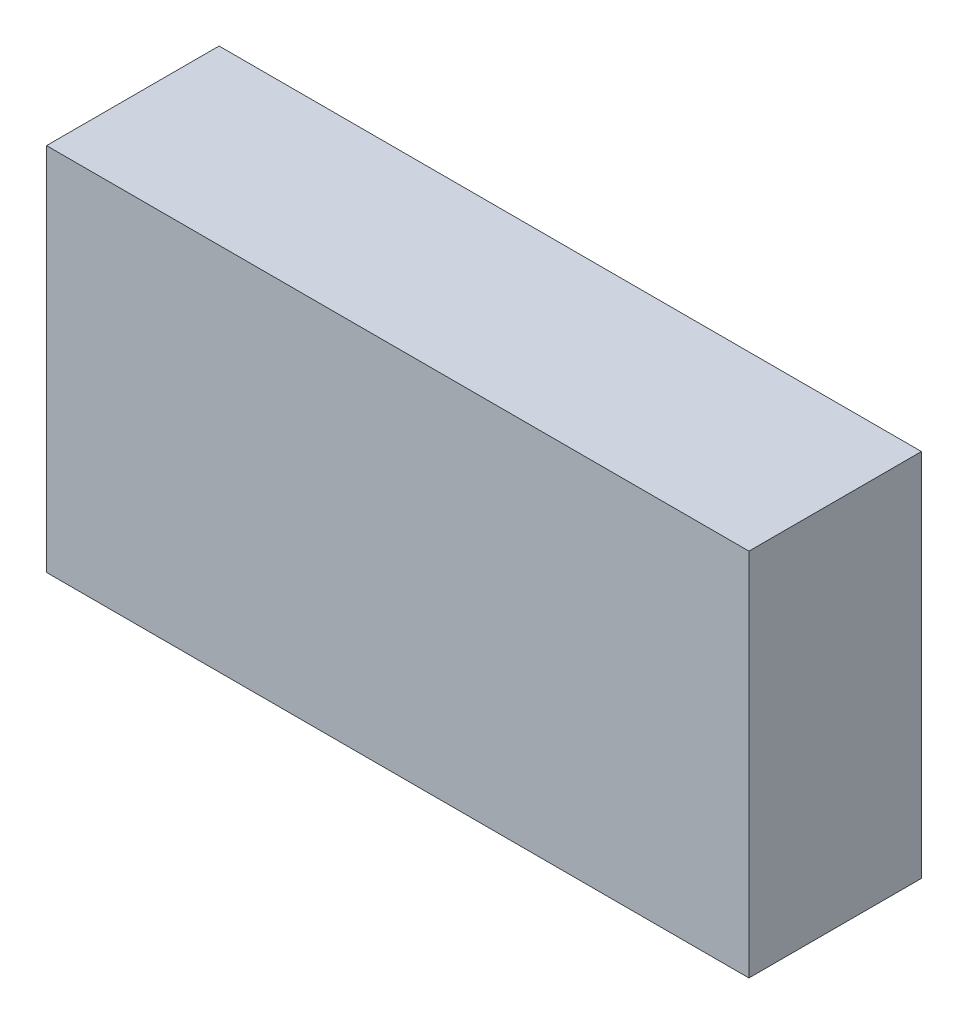
ISO-10303-21;
HEADER;
FILE_DESCRIPTION(('STEP AP214'),'2;1');
FILE_NAME('part.step','',(''),(''),'','','');
FILE_SCHEMA(('AUTOMOTIVE_DESIGN { 1 0 10303 214 1 1 1 1 }'));
ENDSEC;
DATA;
#1=APPLICATION_CONTEXT('core data for automotive mechanical design processes');
#2=APPLICATION_PROTOCOL_DEFINITION('international standard','automotive_design',2000,#1);
#3=PRODUCT_CONTEXT('',#1,'mechanical');
#4=PRODUCT('Part','Part','',(#3));
#5=PRODUCT_RELATED_PRODUCT_CATEGORY('part','',(#4));
#6=PRODUCT_DEFINITION_FORMATION('','',#4);
#7=PRODUCT_DEFINITION_CONTEXT('part definition',#1,'design');
#8=PRODUCT_DEFINITION('design','',#6,#7);
#9=PRODUCT_DEFINITION_SHAPE('','',#8);
#10=(LENGTH_UNIT() NAMED_UNIT(*) SI_UNIT(.MILLI.,.METRE.));
#11=(NAMED_UNIT(*) PLANE_ANGLE_UNIT() SI_UNIT($,.RADIAN.));
#12=(NAMED_UNIT(*) SI_UNIT($,.STERADIAN.) SOLID_ANGLE_UNIT());
#13=UNCERTAINTY_MEASURE_WITH_UNIT(LENGTH_MEASURE(1.E-05),#10,'distance_accuracy_value','');
#14=(GEOMETRIC_REPRESENTATION_CONTEXT(3) GLOBAL_UNCERTAINTY_ASSIGNED_CONTEXT((#13)) GLOBAL_UNIT_ASSIGNED_CONTEXT((#10,
#11,#12)) REPRESENTATION_CONTEXT('',''));
#15=CARTESIAN_POINT('',(0.,0.,0.));
#16=DIRECTION('',(0.,0.,1.));
#17=DIRECTION('',(1.,0.,0.));
#18=AXIS2_PLACEMENT_3D('',#15,#16,#17);
#19=CARTESIAN_POINT('',(-28.5,-15.,14.));
#20=DIRECTION('',(1.,0.,0.));
#21=DIRECTION('',(0.,0.,-1.));
#22=AXIS2_PLACEMENT_3D('',#19,#20,#21);
#23=PLANE('',#22);
#24=DIRECTION('',(0.,-1.,0.));
#25=VECTOR('',#24,1.);
#26=CARTESIAN_POINT('',(-28.5,-15.,0.));
#27=LINE('',#26,#25);
#28=CARTESIAN_POINT('',(-28.5,15.,0.));
#29=VERTEX_POINT('',#28);
#30=CARTESIAN_POINT('',(-28.5,-15.,0.));
#31=VERTEX_POINT('',#30);
#32=EDGE_CURVE('E96',#29,#31,#27,.T.);
#33=ORIENTED_EDGE('',*,*,#32,.T.);
#34=DIRECTION('',(0.,0.,-1.));
#35=VECTOR('',#34,1.);
#36=CARTESIAN_POINT('',(-28.5,-15.,14.));
#37=LINE('',#36,#35);
#38=CARTESIAN_POINT('',(-28.5,-15.,14.));
#39=VERTEX_POINT('',#38);
#40=EDGE_CURVE('E11',#39,#31,#37,.T.);
#41=ORIENTED_EDGE('',*,*,#40,.F.);
#42=DIRECTION('',(0.,-1.,0.));
#43=VECTOR('',#42,1.);
#44=CARTESIAN_POINT('',(-28.5,-15.,14.));
#45=LINE('',#44,#43);
#46=CARTESIAN_POINT('',(-28.5,15.,14.));
#47=VERTEX_POINT('',#46);
#48=EDGE_CURVE('E84',#47,#39,#45,.T.);
#49=ORIENTED_EDGE('',*,*,#48,.F.);
#50=DIRECTION('',(0.,0.,-1.));
#51=VECTOR('',#50,1.);
#52=CARTESIAN_POINT('',(-28.5,15.,14.));
#53=LINE('',#52,#51);
#54=EDGE_CURVE('E92',#47,#29,#53,.T.);
#55=ORIENTED_EDGE('',*,*,#54,.T.);
#56=EDGE_LOOP('',(#33,#41,#49,#55));
#57=FACE_BOUND('',#56,.T.);
#58=ADVANCED_FACE('F33',(#57),#23,.F.);
#59=CARTESIAN_POINT('',(28.5,-15.,14.));
#60=DIRECTION('',(0.,1.,0.));
#61=DIRECTION('',(-1.,0.,0.));
#62=AXIS2_PLACEMENT_3D('',#59,#60,#61);
#63=PLANE('',#62);
#64=DIRECTION('',(1.,0.,0.));
#65=VECTOR('',#64,1.);
#66=CARTESIAN_POINT('',(28.5,-15.,0.));
#67=LINE('',#66,#65);
#68=CARTESIAN_POINT('',(28.5,-15.,0.));
#69=VERTEX_POINT('',#68);
#70=EDGE_CURVE('E88',#31,#69,#67,.T.);
#71=ORIENTED_EDGE('',*,*,#70,.T.);
#72=DIRECTION('',(0.,0.,-1.));
#73=VECTOR('',#72,1.);
#74=CARTESIAN_POINT('',(28.5,-15.,14.));
#75=LINE('',#74,#73);
#76=CARTESIAN_POINT('',(28.5,-15.,14.));
#77=VERTEX_POINT('',#76);
#78=EDGE_CURVE('E41',#77,#69,#75,.T.);
#79=ORIENTED_EDGE('',*,*,#78,.F.);
#80=DIRECTION('',(1.,0.,0.));
#81=VECTOR('',#80,1.);
#82=CARTESIAN_POINT('',(28.5,-15.,14.));
#83=LINE('',#82,#81);
#84=EDGE_CURVE('E79',#39,#77,#83,.T.);
#85=ORIENTED_EDGE('',*,*,#84,.F.);
#86=ORIENTED_EDGE('',*,*,#40,.T.);
#87=EDGE_LOOP('',(#71,#79,#85,#86));
#88=FACE_BOUND('',#87,.T.);
#89=ADVANCED_FACE('F87',(#88),#63,.F.);
#90=CARTESIAN_POINT('',(28.5,-15.,14.));
#91=DIRECTION('',(-1.,0.,0.));
#92=DIRECTION('',(0.,0.,1.));
#93=AXIS2_PLACEMENT_3D('',#90,#91,#92);
#94=PLANE('',#93);
#95=DIRECTION('',(0.,1.,0.));
#96=VECTOR('',#95,1.);
#97=CARTESIAN_POINT('',(28.5,-15.,0.));
#98=LINE('',#97,#96);
#99=CARTESIAN_POINT('',(28.5,15.,0.));
#100=VERTEX_POINT('',#99);
#101=EDGE_CURVE('E66',#69,#100,#98,.T.);
#102=ORIENTED_EDGE('',*,*,#101,.T.);
#103=DIRECTION('',(0.,0.,-1.));
#104=VECTOR('',#103,1.);
#105=CARTESIAN_POINT('',(28.5,15.,14.));
#106=LINE('',#105,#104);
#107=CARTESIAN_POINT('',(28.5,15.,14.));
#108=VERTEX_POINT('',#107);
#109=EDGE_CURVE('E89',#108,#100,#106,.T.);
#110=ORIENTED_EDGE('',*,*,#109,.F.);
#111=DIRECTION('',(0.,1.,0.));
#112=VECTOR('',#111,1.);
#113=CARTESIAN_POINT('',(28.5,-15.,14.));
#114=LINE('',#113,#112);
#115=EDGE_CURVE('E82',#77,#108,#114,.T.);
#116=ORIENTED_EDGE('',*,*,#115,.F.);
#117=ORIENTED_EDGE('',*,*,#78,.T.);
#118=EDGE_LOOP('',(#102,#110,#116,#117));
#119=FACE_BOUND('',#118,.T.);
#120=ADVANCED_FACE('F90',(#119),#94,.F.);
#121=CARTESIAN_POINT('',(28.5,15.,14.));
#122=DIRECTION('',(0.,-1.,0.));
#123=DIRECTION('',(1.,0.,0.));
#124=AXIS2_PLACEMENT_3D('',#121,#122,#123);
#125=PLANE('',#124);
#126=DIRECTION('',(-1.,0.,0.));
#127=VECTOR('',#126,1.);
#128=CARTESIAN_POINT('',(28.5,15.,0.));
#129=LINE('',#128,#127);
#130=EDGE_CURVE('E72',#100,#29,#129,.T.);
#131=ORIENTED_EDGE('',*,*,#130,.T.);
#132=ORIENTED_EDGE('',*,*,#54,.F.);
#133=DIRECTION('',(-1.,0.,0.));
#134=VECTOR('',#133,1.);
#135=CARTESIAN_POINT('',(28.5,15.,14.));
#136=LINE('',#135,#134);
#137=EDGE_CURVE('E49',#108,#47,#136,.T.);
#138=ORIENTED_EDGE('',*,*,#137,.F.);
#139=ORIENTED_EDGE('',*,*,#109,.T.);
#140=EDGE_LOOP('',(#131,#132,#138,#139));
#141=FACE_BOUND('',#140,.T.);
#142=ADVANCED_FACE('F103',(#141),#125,.F.);
#143=CARTESIAN_POINT('',(0.,0.,14.));
#144=DIRECTION('',(0.,0.,1.));
#145=DIRECTION('',(1.,0.,0.));
#146=AXIS2_PLACEMENT_3D('',#143,#144,#145);
#147=PLANE('',#146);
#148=ORIENTED_EDGE('',*,*,#48,.T.);
#149=ORIENTED_EDGE('',*,*,#84,.T.);
#150=ORIENTED_EDGE('',*,*,#115,.T.);
#151=ORIENTED_EDGE('',*,*,#137,.T.);
#152=EDGE_LOOP('',(#148,#149,#150,#151));
#153=FACE_BOUND('',#152,.T.);
#154=ADVANCED_FACE('F80',(#153),#147,.T.);
#155=CARTESIAN_POINT('',(0.,0.,0.));
#156=DIRECTION('',(0.,0.,1.));
#157=DIRECTION('',(1.,0.,0.));
#158=AXIS2_PLACEMENT_3D('',#155,#156,#157);
#159=PLANE('',#158);
#160=ORIENTED_EDGE('',*,*,#32,.F.);
#161=ORIENTED_EDGE('',*,*,#130,.F.);
#162=ORIENTED_EDGE('',*,*,#101,.F.);
#163=ORIENTED_EDGE('',*,*,#70,.F.);
#164=EDGE_LOOP('',(#160,#161,#162,#163));
#165=FACE_BOUND('',#164,.T.);
#166=ADVANCED_FACE('F106',(#165),#159,.F.);
#167=CLOSED_SHELL('',(#58,#89,#120,#142,#154,#166));
#168=MANIFOLD_SOLID_BREP('B2',#167);
#169=ADVANCED_BREP_SHAPE_REPRESENTATION('',(#18,#168),#14);
#170=SHAPE_DEFINITION_REPRESENTATION(#9,#169);
ENDSEC;
END-ISO-10303-21;
